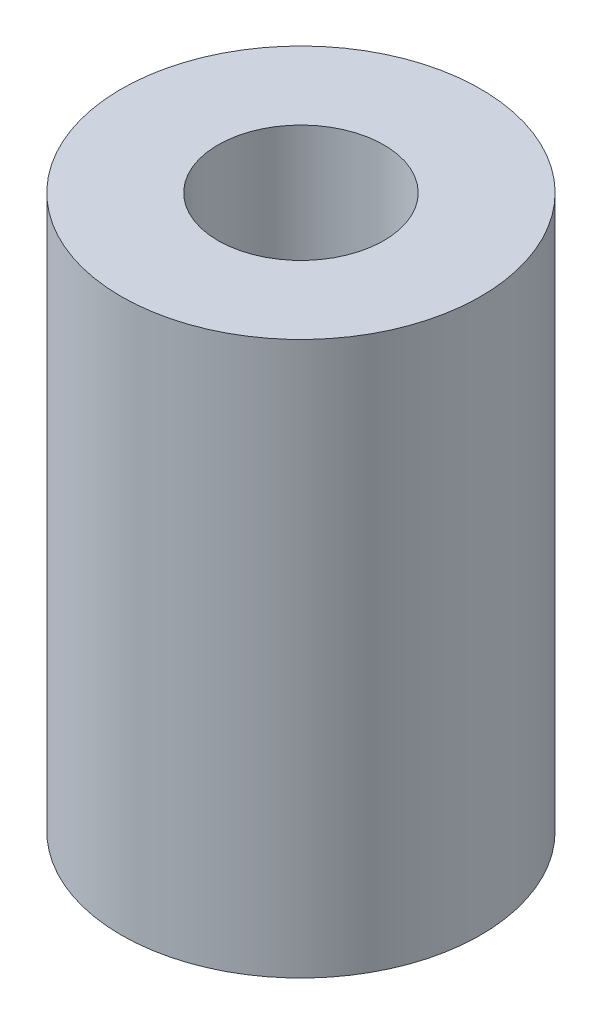
ISO-10303-21;
HEADER;
FILE_DESCRIPTION(('STEP AP214'),'2;1');
FILE_NAME('part.step','',(''),(''),'','','');
FILE_SCHEMA(('AUTOMOTIVE_DESIGN { 1 0 10303 214 1 1 1 1 }'));
ENDSEC;
DATA;
#1=APPLICATION_CONTEXT('core data for automotive mechanical design processes');
#2=APPLICATION_PROTOCOL_DEFINITION('international standard','automotive_design',2000,#1);
#3=PRODUCT_CONTEXT('',#1,'mechanical');
#4=PRODUCT('Part','Part','',(#3));
#5=PRODUCT_RELATED_PRODUCT_CATEGORY('part','',(#4));
#6=PRODUCT_DEFINITION_FORMATION('','',#4);
#7=PRODUCT_DEFINITION_CONTEXT('part definition',#1,'design');
#8=PRODUCT_DEFINITION('design','',#6,#7);
#9=PRODUCT_DEFINITION_SHAPE('','',#8);
#10=(LENGTH_UNIT() NAMED_UNIT(*) SI_UNIT(.MILLI.,.METRE.));
#11=(NAMED_UNIT(*) PLANE_ANGLE_UNIT() SI_UNIT($,.RADIAN.));
#12=(NAMED_UNIT(*) SI_UNIT($,.STERADIAN.) SOLID_ANGLE_UNIT());
#13=UNCERTAINTY_MEASURE_WITH_UNIT(LENGTH_MEASURE(1.E-05),#10,'distance_accuracy_value','');
#14=(GEOMETRIC_REPRESENTATION_CONTEXT(3) GLOBAL_UNCERTAINTY_ASSIGNED_CONTEXT((#13)) GLOBAL_UNIT_ASSIGNED_CONTEXT((#10,
#11,#12)) REPRESENTATION_CONTEXT('',''));
#15=CARTESIAN_POINT('',(0.,0.,0.));
#16=DIRECTION('',(0.,0.,1.));
#17=DIRECTION('',(1.,0.,0.));
#18=AXIS2_PLACEMENT_3D('',#15,#16,#17);
#19=CARTESIAN_POINT('',(0.,10.,0.));
#20=DIRECTION('',(0.,-1.,0.));
#21=DIRECTION('',(0.,0.,-1.));
#22=AXIS2_PLACEMENT_3D('',#19,#20,#21);
#23=CYLINDRICAL_SURFACE('',#22,3.25);
#24=CARTESIAN_POINT('',(0.,10.,0.));
#25=DIRECTION('',(0.,1.,0.));
#26=DIRECTION('',(0.,0.,1.));
#27=AXIS2_PLACEMENT_3D('',#24,#25,#26);
#28=CIRCLE('',#27,3.25);
#29=CARTESIAN_POINT('',(0.,10.,3.25));
#30=VERTEX_POINT('',#29);
#31=EDGE_CURVE('E10',#30,#30,#28,.T.);
#32=ORIENTED_EDGE('',*,*,#31,.F.);
#33=EDGE_LOOP('',(#32));
#34=FACE_BOUND('',#33,.T.);
#35=CARTESIAN_POINT('',(0.,0.,0.));
#36=DIRECTION('',(0.,1.,0.));
#37=DIRECTION('',(0.,0.,1.));
#38=AXIS2_PLACEMENT_3D('',#35,#36,#37);
#39=CIRCLE('',#38,3.25);
#40=CARTESIAN_POINT('',(0.,0.,3.25));
#41=VERTEX_POINT('',#40);
#42=EDGE_CURVE('E40',#41,#41,#39,.T.);
#43=ORIENTED_EDGE('',*,*,#42,.T.);
#44=EDGE_LOOP('',(#43));
#45=FACE_BOUND('',#44,.T.);
#46=ADVANCED_FACE('F37',(#34,#45),#23,.T.);
#47=CARTESIAN_POINT('',(0.,10.,0.));
#48=DIRECTION('',(0.,1.,0.));
#49=DIRECTION('',(0.,0.,1.));
#50=AXIS2_PLACEMENT_3D('',#47,#48,#49);
#51=PLANE('',#50);
#52=CARTESIAN_POINT('',(0.,10.,0.));
#53=DIRECTION('',(0.,1.,0.));
#54=DIRECTION('',(0.,0.,1.));
#55=AXIS2_PLACEMENT_3D('',#52,#53,#54);
#56=CIRCLE('',#55,1.5);
#57=CARTESIAN_POINT('',(0.,10.,1.5));
#58=VERTEX_POINT('',#57);
#59=EDGE_CURVE('E49',#58,#58,#56,.F.);
#60=ORIENTED_EDGE('',*,*,#59,.T.);
#61=EDGE_LOOP('',(#60));
#62=FACE_BOUND('',#61,.T.);
#63=ORIENTED_EDGE('',*,*,#31,.T.);
#64=EDGE_LOOP('',(#63));
#65=FACE_BOUND('',#64,.T.);
#66=ADVANCED_FACE('F69',(#62,#65),#51,.T.);
#67=CARTESIAN_POINT('',(0.,0.,0.));
#68=DIRECTION('',(0.,1.,0.));
#69=DIRECTION('',(0.,0.,1.));
#70=AXIS2_PLACEMENT_3D('',#67,#68,#69);
#71=PLANE('',#70);
#72=CARTESIAN_POINT('',(0.,0.,0.));
#73=DIRECTION('',(0.,1.,0.));
#74=DIRECTION('',(0.,0.,1.));
#75=AXIS2_PLACEMENT_3D('',#72,#73,#74);
#76=CIRCLE('',#75,1.5);
#77=CARTESIAN_POINT('',(0.,0.,1.5));
#78=VERTEX_POINT('',#77);
#79=EDGE_CURVE('E54',#78,#78,#76,.T.);
#80=ORIENTED_EDGE('',*,*,#79,.T.);
#81=EDGE_LOOP('',(#80));
#82=FACE_BOUND('',#81,.T.);
#83=ORIENTED_EDGE('',*,*,#42,.F.);
#84=EDGE_LOOP('',(#83));
#85=FACE_BOUND('',#84,.T.);
#86=ADVANCED_FACE('F59',(#82,#85),#71,.F.);
#87=CARTESIAN_POINT('',(0.,28.,0.));
#88=DIRECTION('',(0.,-1.,0.));
#89=DIRECTION('',(0.,0.,-1.));
#90=AXIS2_PLACEMENT_3D('',#87,#88,#89);
#91=CYLINDRICAL_SURFACE('',#90,1.5);
#92=ORIENTED_EDGE('',*,*,#59,.F.);
#93=EDGE_LOOP('',(#92));
#94=FACE_BOUND('',#93,.T.);
#95=ORIENTED_EDGE('',*,*,#79,.F.);
#96=EDGE_LOOP('',(#95));
#97=FACE_BOUND('',#96,.T.);
#98=ADVANCED_FACE('F62',(#94,#97),#91,.F.);
#99=CLOSED_SHELL('',(#46,#66,#86,#98));
#100=MANIFOLD_SOLID_BREP('B2',#99);
#101=ADVANCED_BREP_SHAPE_REPRESENTATION('',(#18,#100),#14);
#102=SHAPE_DEFINITION_REPRESENTATION(#9,#101);
ENDSEC;
END-ISO-10303-21;
